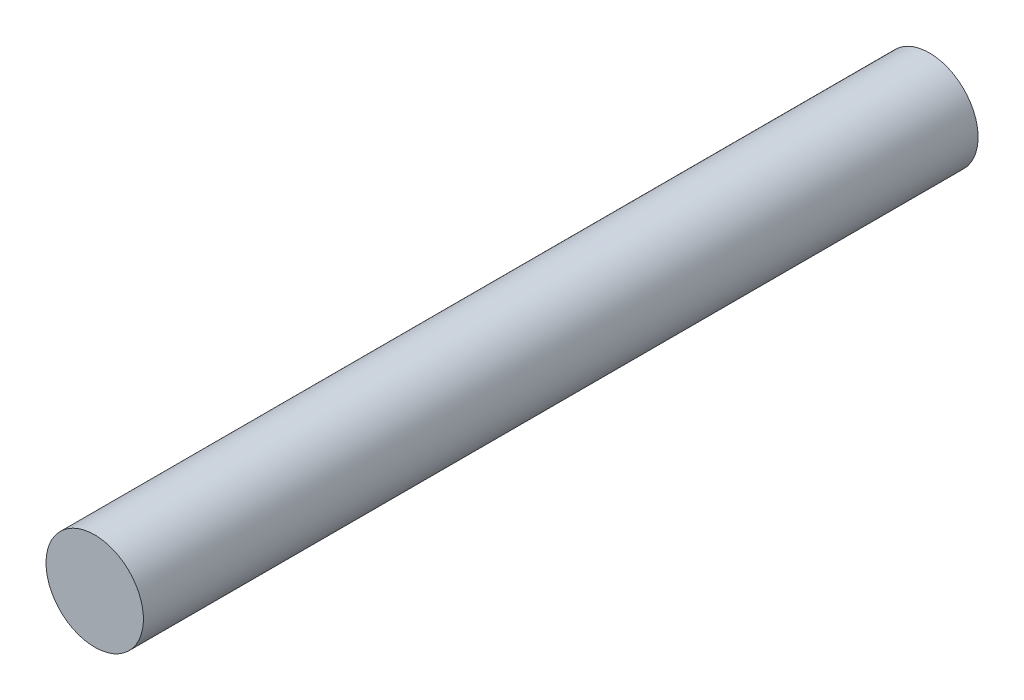
ISO-10303-21;
HEADER;
FILE_DESCRIPTION(('STEP AP214'),'2;1');
FILE_NAME('part.step','',(''),(''),'','','');
FILE_SCHEMA(('AUTOMOTIVE_DESIGN { 1 0 10303 214 1 1 1 1 }'));
ENDSEC;
DATA;
#1=APPLICATION_CONTEXT('core data for automotive mechanical design processes');
#2=APPLICATION_PROTOCOL_DEFINITION('international standard','automotive_design',2000,#1);
#3=PRODUCT_CONTEXT('',#1,'mechanical');
#4=PRODUCT('Part','Part','',(#3));
#5=PRODUCT_RELATED_PRODUCT_CATEGORY('part','',(#4));
#6=PRODUCT_DEFINITION_FORMATION('','',#4);
#7=PRODUCT_DEFINITION_CONTEXT('part definition',#1,'design');
#8=PRODUCT_DEFINITION('design','',#6,#7);
#9=PRODUCT_DEFINITION_SHAPE('','',#8);
#10=(LENGTH_UNIT() NAMED_UNIT(*) SI_UNIT(.MILLI.,.METRE.));
#11=(NAMED_UNIT(*) PLANE_ANGLE_UNIT() SI_UNIT($,.RADIAN.));
#12=(NAMED_UNIT(*) SI_UNIT($,.STERADIAN.) SOLID_ANGLE_UNIT());
#13=UNCERTAINTY_MEASURE_WITH_UNIT(LENGTH_MEASURE(1.E-05),#10,'distance_accuracy_value','');
#14=(GEOMETRIC_REPRESENTATION_CONTEXT(3) GLOBAL_UNCERTAINTY_ASSIGNED_CONTEXT((#13)) GLOBAL_UNIT_ASSIGNED_CONTEXT((#10,
#11,#12)) REPRESENTATION_CONTEXT('',''));
#15=CARTESIAN_POINT('',(0.,0.,0.));
#16=DIRECTION('',(0.,0.,1.));
#17=DIRECTION('',(1.,0.,0.));
#18=AXIS2_PLACEMENT_3D('',#15,#16,#17);
#19=CARTESIAN_POINT('',(0.,0.,38.1));
#20=DIRECTION('',(0.,0.,-1.));
#21=DIRECTION('',(-1.,0.,0.));
#22=AXIS2_PLACEMENT_3D('',#19,#20,#21);
#23=CYLINDRICAL_SURFACE('',#22,2.2225);
#24=CARTESIAN_POINT('',(0.,0.,38.1));
#25=DIRECTION('',(0.,0.,1.));
#26=DIRECTION('',(1.,0.,0.));
#27=AXIS2_PLACEMENT_3D('',#24,#25,#26);
#28=CIRCLE('',#27,2.2225);
#29=CARTESIAN_POINT('',(-2.2225,0.,38.1));
#30=VERTEX_POINT('',#29);
#31=EDGE_CURVE('E10',#30,#30,#28,.T.);
#32=CARTESIAN_POINT('',(0.,0.,0.));
#33=DIRECTION('',(0.,0.,1.));
#34=DIRECTION('',(1.,0.,0.));
#35=AXIS2_PLACEMENT_3D('',#32,#33,#34);
#36=CIRCLE('',#35,2.2225);
#37=CARTESIAN_POINT('',(-2.2225,0.,0.));
#38=VERTEX_POINT('',#37);
#39=EDGE_CURVE('E46',#38,#38,#36,.T.);
#40=CARTESIAN_POINT('',(-2.2225,0.,38.1));
#41=CARTESIAN_POINT('',(-2.2225,0.,37.703125));
#42=CARTESIAN_POINT('',(-2.2225,0.,37.30625));
#43=CARTESIAN_POINT('',(-2.2225,0.,36.5125));
#44=CARTESIAN_POINT('',(-2.2225,0.,36.115625));
#45=CARTESIAN_POINT('',(-2.2225,0.,35.321875));
#46=CARTESIAN_POINT('',(-2.2225,0.,34.925));
#47=CARTESIAN_POINT('',(-2.2225,0.,34.13125));
#48=CARTESIAN_POINT('',(-2.2225,0.,33.734375));
#49=CARTESIAN_POINT('',(-2.2225,0.,32.940625));
#50=CARTESIAN_POINT('',(-2.2225,0.,32.54375));
#51=CARTESIAN_POINT('',(-2.2225,0.,31.75));
#52=CARTESIAN_POINT('',(-2.2225,0.,31.353125));
#53=CARTESIAN_POINT('',(-2.2225,0.,30.559375));
#54=CARTESIAN_POINT('',(-2.2225,0.,30.1625));
#55=CARTESIAN_POINT('',(-2.2225,0.,29.36875));
#56=CARTESIAN_POINT('',(-2.2225,0.,28.971875));
#57=CARTESIAN_POINT('',(-2.2225,0.,28.178125));
#58=CARTESIAN_POINT('',(-2.2225,0.,27.78125));
#59=CARTESIAN_POINT('',(-2.2225,0.,26.9875));
#60=CARTESIAN_POINT('',(-2.2225,0.,26.590625));
#61=CARTESIAN_POINT('',(-2.2225,0.,25.796875));
#62=CARTESIAN_POINT('',(-2.2225,0.,25.4));
#63=CARTESIAN_POINT('',(-2.2225,0.,24.60625));
#64=CARTESIAN_POINT('',(-2.2225,0.,24.209375));
#65=CARTESIAN_POINT('',(-2.2225,0.,23.415625));
#66=CARTESIAN_POINT('',(-2.2225,0.,23.01875));
#67=CARTESIAN_POINT('',(-2.2225,0.,22.225));
#68=CARTESIAN_POINT('',(-2.2225,0.,21.828125));
#69=CARTESIAN_POINT('',(-2.2225,0.,21.034375));
#70=CARTESIAN_POINT('',(-2.2225,0.,20.6375));
#71=CARTESIAN_POINT('',(-2.2225,0.,19.84375));
#72=CARTESIAN_POINT('',(-2.2225,0.,19.446875));
#73=CARTESIAN_POINT('',(-2.2225,0.,18.653125));
#74=CARTESIAN_POINT('',(-2.2225,0.,18.25625));
#75=CARTESIAN_POINT('',(-2.2225,0.,17.4625));
#76=CARTESIAN_POINT('',(-2.2225,0.,17.065625));
#77=CARTESIAN_POINT('',(-2.2225,0.,16.271875));
#78=CARTESIAN_POINT('',(-2.2225,0.,15.875));
#79=CARTESIAN_POINT('',(-2.2225,0.,15.08125));
#80=CARTESIAN_POINT('',(-2.2225,0.,14.684375));
#81=CARTESIAN_POINT('',(-2.2225,0.,13.890625));
#82=CARTESIAN_POINT('',(-2.2225,0.,13.49375));
#83=CARTESIAN_POINT('',(-2.2225,0.,12.7));
#84=CARTESIAN_POINT('',(-2.2225,0.,12.303125));
#85=CARTESIAN_POINT('',(-2.2225,0.,11.509375));
#86=CARTESIAN_POINT('',(-2.2225,0.,11.1125));
#87=CARTESIAN_POINT('',(-2.2225,0.,10.31875));
#88=CARTESIAN_POINT('',(-2.2225,0.,9.92187499999999));
#89=CARTESIAN_POINT('',(-2.2225,0.,9.128125));
#90=CARTESIAN_POINT('',(-2.2225,0.,8.73124999999999));
#91=CARTESIAN_POINT('',(-2.2225,0.,7.93749999999999));
#92=CARTESIAN_POINT('',(-2.2225,0.,7.54062499999999));
#93=CARTESIAN_POINT('',(-2.2225,0.,6.746875));
#94=CARTESIAN_POINT('',(-2.2225,0.,6.35));
#95=CARTESIAN_POINT('',(-2.2225,0.,5.55625));
#96=CARTESIAN_POINT('',(-2.2225,0.,5.159375));
#97=CARTESIAN_POINT('',(-2.2225,0.,4.365625));
#98=CARTESIAN_POINT('',(-2.2225,0.,3.96875));
#99=CARTESIAN_POINT('',(-2.2225,0.,3.175));
#100=CARTESIAN_POINT('',(-2.2225,0.,2.778125));
#101=CARTESIAN_POINT('',(-2.2225,0.,1.984375));
#102=CARTESIAN_POINT('',(-2.2225,0.,1.5875));
#103=CARTESIAN_POINT('',(-2.2225,0.,0.79375));
#104=CARTESIAN_POINT('',(-2.2225,0.,0.396875));
#105=CARTESIAN_POINT('',(-2.2225,0.,0.));
#106=B_SPLINE_CURVE_WITH_KNOTS('',3,(#40,#41,#42,#43,#44,#45,#46,#47,#48,#49,#50,#51,#52,#53,
#54,#55,#56,#57,#58,#59,#60,#61,#62,#63,#64,#65,#66,#67,#68,#69,#70,#71,#72,#73,#74,#75,#76,#77,
#78,#79,#80,#81,#82,#83,#84,#85,#86,#87,#88,#89,#90,#91,#92,#93,#94,#95,#96,#97,#98,#99,#100,
#101,#102,#103,#104,#105),.UNSPECIFIED.,.F.,.F.,(4,2,2,2,2,2,2,2,2,2,2,2,2,2,2,2,2,2,2,2,2,2,2,
2,2,2,2,2,2,2,2,2,4),(0.,1.190625,2.38125,3.571875,4.7625,5.953125,7.14375,8.334375,
9.52500000000001,10.715625,11.90625,13.096875,14.2875,15.478125,16.66875,17.859375,19.05,
20.240625,21.43125,22.621875,23.8125,25.003125,26.19375,27.384375,28.575,29.765625,30.95625,
32.146875,33.3375,34.528125,35.71875,36.909375,38.1),.UNSPECIFIED.);
#107=EDGE_CURVE('BSEAM43',#30,#38,#106,.T.);
#108=ORIENTED_EDGE('',*,*,#31,.F.);
#109=ORIENTED_EDGE('',*,*,#39,.T.);
#110=ORIENTED_EDGE('',*,*,#107,.T.);
#111=ORIENTED_EDGE('',*,*,#107,.F.);
#112=EDGE_LOOP('',(#108,#110,#109,#111));
#113=FACE_BOUND('',#112,.T.);
#114=ADVANCED_FACE('F43',(#113),#23,.T.);
#115=CARTESIAN_POINT('',(0.,0.,38.1));
#116=DIRECTION('',(0.,0.,1.));
#117=DIRECTION('',(1.,0.,0.));
#118=AXIS2_PLACEMENT_3D('',#115,#116,#117);
#119=PLANE('',#118);
#120=ORIENTED_EDGE('',*,*,#31,.T.);
#121=EDGE_LOOP('',(#120));
#122=FACE_BOUND('',#121,.T.);
#123=ADVANCED_FACE('F58',(#122),#119,.T.);
#124=CARTESIAN_POINT('',(0.,0.,0.));
#125=DIRECTION('',(0.,0.,1.));
#126=DIRECTION('',(1.,0.,0.));
#127=AXIS2_PLACEMENT_3D('',#124,#125,#126);
#128=PLANE('',#127);
#129=ORIENTED_EDGE('',*,*,#39,.F.);
#130=EDGE_LOOP('',(#129));
#131=FACE_BOUND('',#130,.T.);
#132=ADVANCED_FACE('F59',(#131),#128,.F.);
#133=CLOSED_SHELL('',(#114,#123,#132));
#134=MANIFOLD_SOLID_BREP('B2',#133);
#135=ADVANCED_BREP_SHAPE_REPRESENTATION('',(#18,#134),#14);
#136=SHAPE_DEFINITION_REPRESENTATION(#9,#135);
ENDSEC;
END-ISO-10303-21;
